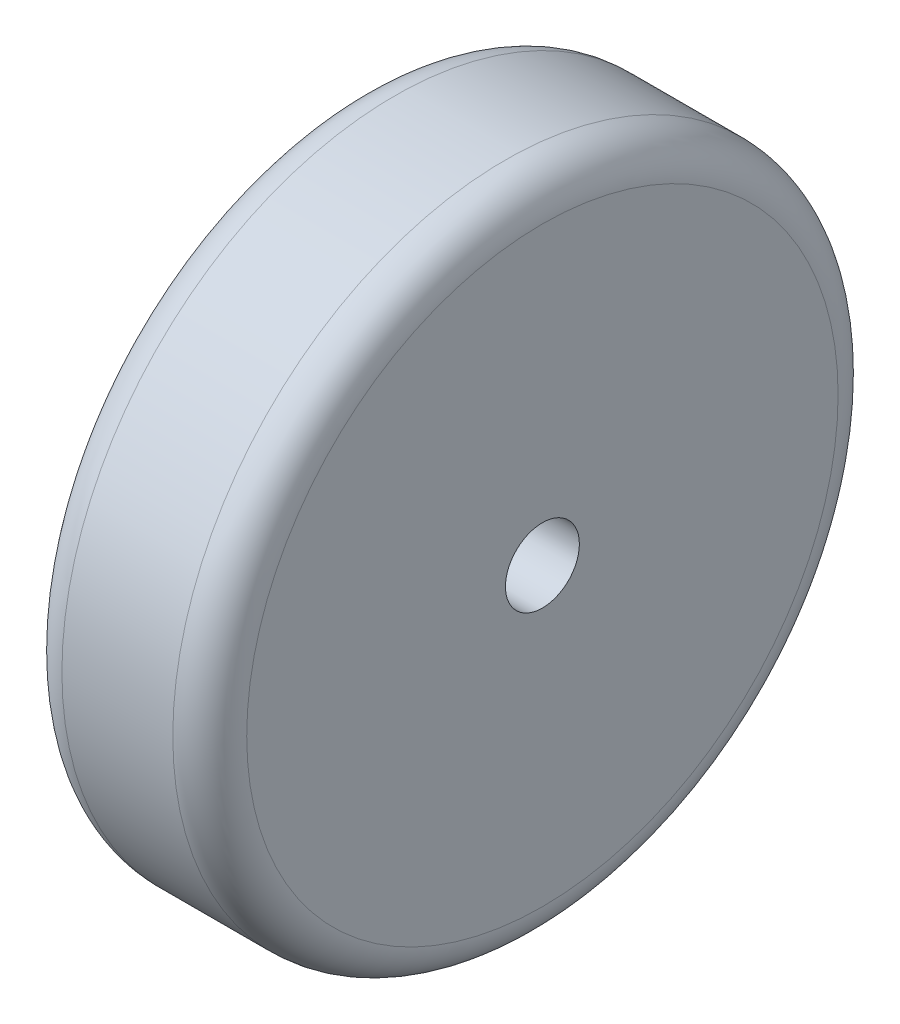
ISO-10303-21;
HEADER;
FILE_DESCRIPTION(('STEP AP214'),'2;1');
FILE_NAME('part.step','',(''),(''),'','','');
FILE_SCHEMA(('AUTOMOTIVE_DESIGN { 1 0 10303 214 1 1 1 1 }'));
ENDSEC;
DATA;
#1=APPLICATION_CONTEXT('core data for automotive mechanical design processes');
#2=APPLICATION_PROTOCOL_DEFINITION('international standard','automotive_design',2000,#1);
#3=PRODUCT_CONTEXT('',#1,'mechanical');
#4=PRODUCT('Part','Part','',(#3));
#5=PRODUCT_RELATED_PRODUCT_CATEGORY('part','',(#4));
#6=PRODUCT_DEFINITION_FORMATION('','',#4);
#7=PRODUCT_DEFINITION_CONTEXT('part definition',#1,'design');
#8=PRODUCT_DEFINITION('design','',#6,#7);
#9=PRODUCT_DEFINITION_SHAPE('','',#8);
#10=(LENGTH_UNIT() NAMED_UNIT(*) SI_UNIT(.MILLI.,.METRE.));
#11=(NAMED_UNIT(*) PLANE_ANGLE_UNIT() SI_UNIT($,.RADIAN.));
#12=(NAMED_UNIT(*) SI_UNIT($,.STERADIAN.) SOLID_ANGLE_UNIT());
#13=UNCERTAINTY_MEASURE_WITH_UNIT(LENGTH_MEASURE(1.E-05),#10,'distance_accuracy_value','');
#14=(GEOMETRIC_REPRESENTATION_CONTEXT(3) GLOBAL_UNCERTAINTY_ASSIGNED_CONTEXT((#13)) GLOBAL_UNIT_ASSIGNED_CONTEXT((#10,
#11,#12)) REPRESENTATION_CONTEXT('',''));
#15=CARTESIAN_POINT('',(0.,0.,0.));
#16=DIRECTION('',(0.,0.,1.));
#17=DIRECTION('',(1.,0.,0.));
#18=AXIS2_PLACEMENT_3D('',#15,#16,#17);
#19=CARTESIAN_POINT('',(25.,0.,0.));
#20=DIRECTION('',(1.,0.,0.));
#21=DIRECTION('',(0.,0.,-1.));
#22=AXIS2_PLACEMENT_3D('',#19,#20,#21);
#23=PLANE('',#22);
#24=CARTESIAN_POINT('',(25.,0.,0.));
#25=DIRECTION('',(1.,0.,0.));
#26=DIRECTION('',(0.,0.,-1.));
#27=AXIS2_PLACEMENT_3D('',#24,#25,#26);
#28=CIRCLE('',#27,80.);
#29=CARTESIAN_POINT('',(25.,0.,-80.));
#30=VERTEX_POINT('',#29);
#31=EDGE_CURVE('E10',#30,#30,#28,.T.);
#32=ORIENTED_EDGE('',*,*,#31,.T.);
#33=EDGE_LOOP('',(#32));
#34=FACE_BOUND('',#33,.T.);
#35=CARTESIAN_POINT('',(25.,0.,0.));
#36=DIRECTION('',(1.,0.,0.));
#37=DIRECTION('',(0.,0.,-1.));
#38=AXIS2_PLACEMENT_3D('',#35,#36,#37);
#39=CIRCLE('',#38,10.);
#40=CARTESIAN_POINT('',(25.,0.,-10.));
#41=VERTEX_POINT('',#40);
#42=EDGE_CURVE('E51',#41,#41,#39,.T.);
#43=ORIENTED_EDGE('',*,*,#42,.F.);
#44=EDGE_LOOP('',(#43));
#45=FACE_BOUND('',#44,.T.);
#46=ADVANCED_FACE('F31',(#34,#45),#23,.T.);
#47=CARTESIAN_POINT('',(-25.,0.,0.));
#48=DIRECTION('',(1.,0.,0.));
#49=DIRECTION('',(0.,0.,-1.));
#50=AXIS2_PLACEMENT_3D('',#47,#48,#49);
#51=PLANE('',#50);
#52=CARTESIAN_POINT('',(-25.,0.,0.));
#53=DIRECTION('',(1.,0.,0.));
#54=DIRECTION('',(0.,0.,-1.));
#55=AXIS2_PLACEMENT_3D('',#52,#53,#54);
#56=CIRCLE('',#55,80.);
#57=CARTESIAN_POINT('',(-25.,0.,-80.));
#58=VERTEX_POINT('',#57);
#59=EDGE_CURVE('E38',#58,#58,#56,.F.);
#60=ORIENTED_EDGE('',*,*,#59,.T.);
#61=EDGE_LOOP('',(#60));
#62=FACE_BOUND('',#61,.T.);
#63=CARTESIAN_POINT('',(-25.,0.,0.));
#64=DIRECTION('',(1.,0.,0.));
#65=DIRECTION('',(0.,0.,-1.));
#66=AXIS2_PLACEMENT_3D('',#63,#64,#65);
#67=CIRCLE('',#66,10.);
#68=CARTESIAN_POINT('',(-25.,0.,-10.));
#69=VERTEX_POINT('',#68);
#70=EDGE_CURVE('E52',#69,#69,#67,.T.);
#71=ORIENTED_EDGE('',*,*,#70,.T.);
#72=EDGE_LOOP('',(#71));
#73=FACE_BOUND('',#72,.T.);
#74=ADVANCED_FACE('F62',(#62,#73),#51,.F.);
#75=CARTESIAN_POINT('',(25.,0.,0.));
#76=DIRECTION('',(-1.,0.,0.));
#77=DIRECTION('',(0.,0.,1.));
#78=AXIS2_PLACEMENT_3D('',#75,#76,#77);
#79=CYLINDRICAL_SURFACE('',#78,90.);
#80=CARTESIAN_POINT('',(-15.,0.,0.));
#81=DIRECTION('',(1.,0.,0.));
#82=DIRECTION('',(0.,0.,-1.));
#83=AXIS2_PLACEMENT_3D('',#80,#81,#82);
#84=CIRCLE('',#83,90.);
#85=CARTESIAN_POINT('',(-15.,0.,-90.));
#86=VERTEX_POINT('',#85);
#87=EDGE_CURVE('E42',#86,#86,#84,.T.);
#88=ORIENTED_EDGE('',*,*,#87,.T.);
#89=EDGE_LOOP('',(#88));
#90=FACE_BOUND('',#89,.T.);
#91=CARTESIAN_POINT('',(15.,0.,0.));
#92=DIRECTION('',(1.,0.,0.));
#93=DIRECTION('',(0.,0.,-1.));
#94=AXIS2_PLACEMENT_3D('',#91,#92,#93);
#95=CIRCLE('',#94,90.);
#96=CARTESIAN_POINT('',(15.,0.,-90.));
#97=VERTEX_POINT('',#96);
#98=EDGE_CURVE('E46',#97,#97,#95,.F.);
#99=ORIENTED_EDGE('',*,*,#98,.T.);
#100=EDGE_LOOP('',(#99));
#101=FACE_BOUND('',#100,.T.);
#102=ADVANCED_FACE('F67',(#90,#101),#79,.T.);
#103=CARTESIAN_POINT('',(25.,0.,0.));
#104=DIRECTION('',(-1.,0.,0.));
#105=DIRECTION('',(0.,0.,1.));
#106=AXIS2_PLACEMENT_3D('',#103,#104,#105);
#107=CYLINDRICAL_SURFACE('',#106,10.);
#108=ORIENTED_EDGE('',*,*,#42,.T.);
#109=EDGE_LOOP('',(#108));
#110=FACE_BOUND('',#109,.T.);
#111=ORIENTED_EDGE('',*,*,#70,.F.);
#112=EDGE_LOOP('',(#111));
#113=FACE_BOUND('',#112,.T.);
#114=ADVANCED_FACE('F58',(#110,#113),#107,.F.);
#115=CARTESIAN_POINT('',(-15.,0.,0.));
#116=DIRECTION('',(1.,0.,0.));
#117=DIRECTION('',(0.,0.,-1.));
#118=AXIS2_PLACEMENT_3D('',#115,#116,#117);
#119=TOROIDAL_SURFACE('',#118,80.,10.);
#120=ORIENTED_EDGE('',*,*,#59,.F.);
#121=EDGE_LOOP('',(#120));
#122=FACE_BOUND('',#121,.T.);
#123=ORIENTED_EDGE('',*,*,#87,.F.);
#124=EDGE_LOOP('',(#123));
#125=FACE_BOUND('',#124,.T.);
#126=ADVANCED_FACE('F73',(#122,#125),#119,.T.);
#127=CARTESIAN_POINT('',(15.,0.,0.));
#128=DIRECTION('',(1.,0.,0.));
#129=DIRECTION('',(0.,0.,-1.));
#130=AXIS2_PLACEMENT_3D('',#127,#128,#129);
#131=TOROIDAL_SURFACE('',#130,80.,10.);
#132=ORIENTED_EDGE('',*,*,#98,.F.);
#133=EDGE_LOOP('',(#132));
#134=FACE_BOUND('',#133,.T.);
#135=ORIENTED_EDGE('',*,*,#31,.F.);
#136=EDGE_LOOP('',(#135));
#137=FACE_BOUND('',#136,.T.);
#138=ADVANCED_FACE('F33',(#134,#137),#131,.T.);
#139=CLOSED_SHELL('',(#46,#74,#102,#114,#126,#138));
#140=MANIFOLD_SOLID_BREP('B2',#139);
#141=ADVANCED_BREP_SHAPE_REPRESENTATION('',(#18,#140),#14);
#142=SHAPE_DEFINITION_REPRESENTATION(#9,#141);
ENDSEC;
END-ISO-10303-21;
